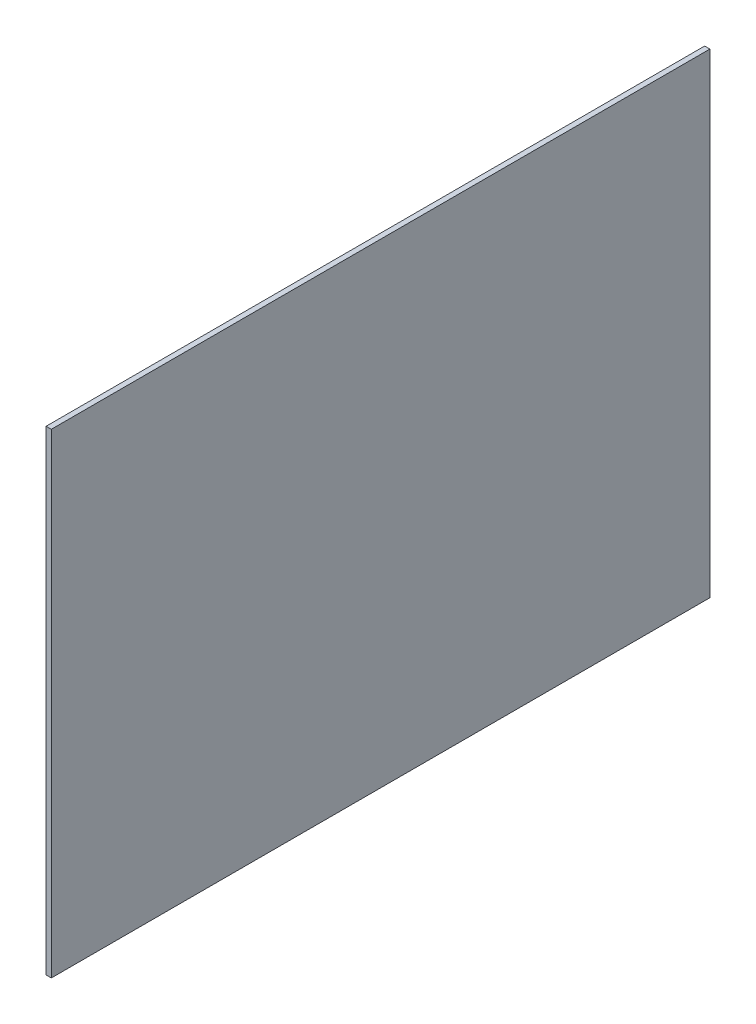
ISO-10303-21;
HEADER;
FILE_DESCRIPTION(('STEP AP214'),'2;1');
FILE_NAME('part.step','',(''),(''),'','','');
FILE_SCHEMA(('AUTOMOTIVE_DESIGN { 1 0 10303 214 1 1 1 1 }'));
ENDSEC;
DATA;
#1=APPLICATION_CONTEXT('core data for automotive mechanical design processes');
#2=APPLICATION_PROTOCOL_DEFINITION('international standard','automotive_design',2000,#1);
#3=PRODUCT_CONTEXT('',#1,'mechanical');
#4=PRODUCT('Part','Part','',(#3));
#5=PRODUCT_RELATED_PRODUCT_CATEGORY('part','',(#4));
#6=PRODUCT_DEFINITION_FORMATION('','',#4);
#7=PRODUCT_DEFINITION_CONTEXT('part definition',#1,'design');
#8=PRODUCT_DEFINITION('design','',#6,#7);
#9=PRODUCT_DEFINITION_SHAPE('','',#8);
#10=(LENGTH_UNIT() NAMED_UNIT(*) SI_UNIT(.MILLI.,.METRE.));
#11=(NAMED_UNIT(*) PLANE_ANGLE_UNIT() SI_UNIT($,.RADIAN.));
#12=(NAMED_UNIT(*) SI_UNIT($,.STERADIAN.) SOLID_ANGLE_UNIT());
#13=UNCERTAINTY_MEASURE_WITH_UNIT(LENGTH_MEASURE(1.E-05),#10,'distance_accuracy_value','');
#14=(GEOMETRIC_REPRESENTATION_CONTEXT(3) GLOBAL_UNCERTAINTY_ASSIGNED_CONTEXT((#13)) GLOBAL_UNIT_ASSIGNED_CONTEXT((#10,
#11,#12)) REPRESENTATION_CONTEXT('',''));
#15=CARTESIAN_POINT('',(0.,0.,0.));
#16=DIRECTION('',(0.,0.,1.));
#17=DIRECTION('',(1.,0.,0.));
#18=AXIS2_PLACEMENT_3D('',#15,#16,#17);
#19=CARTESIAN_POINT('',(-754.231317194732,90.909375740857,128.020467364411));
#20=DIRECTION('',(0.,0.,-1.));
#21=DIRECTION('',(-1.,0.,0.));
#22=AXIS2_PLACEMENT_3D('',#19,#20,#21);
#23=PLANE('',#22);
#24=DIRECTION('',(0.,-1.,0.));
#25=VECTOR('',#24,1.);
#26=CARTESIAN_POINT('',(-755.231317194732,90.909375740857,128.020467364411));
#27=LINE('',#26,#25);
#28=CARTESIAN_POINT('',(-755.231317194732,90.909375740857,128.020467364411));
#29=VERTEX_POINT('',#28);
#30=CARTESIAN_POINT('',(-755.231317194732,-1.35308431126191E-13,128.020467364411));
#31=VERTEX_POINT('',#30);
#32=EDGE_CURVE('E101',#29,#31,#27,.T.);
#33=ORIENTED_EDGE('',*,*,#32,.T.);
#34=DIRECTION('',(-1.,0.,0.));
#35=VECTOR('',#34,1.);
#36=CARTESIAN_POINT('',(-754.231317194732,-1.35308431126191E-13,128.020467364411));
#37=LINE('',#36,#35);
#38=CARTESIAN_POINT('',(-754.231317194732,-1.35308431126191E-13,128.020467364411));
#39=VERTEX_POINT('',#38);
#40=EDGE_CURVE('E11',#39,#31,#37,.T.);
#41=ORIENTED_EDGE('',*,*,#40,.F.);
#42=DIRECTION('',(0.,-1.,0.));
#43=VECTOR('',#42,1.);
#44=CARTESIAN_POINT('',(-754.231317194732,90.909375740857,128.020467364411));
#45=LINE('',#44,#43);
#46=CARTESIAN_POINT('',(-754.231317194732,90.909375740857,128.020467364411));
#47=VERTEX_POINT('',#46);
#48=EDGE_CURVE('E89',#47,#39,#45,.T.);
#49=ORIENTED_EDGE('',*,*,#48,.F.);
#50=DIRECTION('',(-1.,0.,0.));
#51=VECTOR('',#50,1.);
#52=CARTESIAN_POINT('',(-754.231317194732,90.909375740857,128.020467364411));
#53=LINE('',#52,#51);
#54=EDGE_CURVE('E97',#47,#29,#53,.T.);
#55=ORIENTED_EDGE('',*,*,#54,.T.);
#56=EDGE_LOOP('',(#33,#41,#49,#55));
#57=FACE_BOUND('',#56,.T.);
#58=ADVANCED_FACE('F38',(#57),#23,.F.);
#59=CARTESIAN_POINT('',(-754.231317194732,-1.35308431126191E-13,128.020467364411));
#60=DIRECTION('',(0.,1.,0.));
#61=DIRECTION('',(0.,0.,1.));
#62=AXIS2_PLACEMENT_3D('',#59,#60,#61);
#63=PLANE('',#62);
#64=DIRECTION('',(0.,0.,-1.));
#65=VECTOR('',#64,1.);
#66=CARTESIAN_POINT('',(-755.231317194732,-1.35308431126191E-13,128.020467364411));
#67=LINE('',#66,#65);
#68=CARTESIAN_POINT('',(-755.231317194732,-1.35308431126191E-13,2.02046736441129));
#69=VERTEX_POINT('',#68);
#70=EDGE_CURVE('E93',#31,#69,#67,.T.);
#71=ORIENTED_EDGE('',*,*,#70,.T.);
#72=DIRECTION('',(-1.,0.,0.));
#73=VECTOR('',#72,1.);
#74=CARTESIAN_POINT('',(-754.231317194732,-1.35308431126191E-13,2.02046736441129));
#75=LINE('',#74,#73);
#76=CARTESIAN_POINT('',(-754.231317194732,-1.35308431126191E-13,2.02046736441129));
#77=VERTEX_POINT('',#76);
#78=EDGE_CURVE('E46',#77,#69,#75,.T.);
#79=ORIENTED_EDGE('',*,*,#78,.F.);
#80=DIRECTION('',(0.,0.,-1.));
#81=VECTOR('',#80,1.);
#82=CARTESIAN_POINT('',(-754.231317194732,-1.35308431126191E-13,128.020467364411));
#83=LINE('',#82,#81);
#84=EDGE_CURVE('E84',#39,#77,#83,.T.);
#85=ORIENTED_EDGE('',*,*,#84,.F.);
#86=ORIENTED_EDGE('',*,*,#40,.T.);
#87=EDGE_LOOP('',(#71,#79,#85,#86));
#88=FACE_BOUND('',#87,.T.);
#89=ADVANCED_FACE('F92',(#88),#63,.F.);
#90=CARTESIAN_POINT('',(-754.231317194732,90.909375740857,2.02046736441129));
#91=DIRECTION('',(0.,0.,1.));
#92=DIRECTION('',(1.,0.,0.));
#93=AXIS2_PLACEMENT_3D('',#90,#91,#92);
#94=PLANE('',#93);
#95=DIRECTION('',(0.,1.,0.));
#96=VECTOR('',#95,1.);
#97=CARTESIAN_POINT('',(-755.231317194732,90.909375740857,2.02046736441129));
#98=LINE('',#97,#96);
#99=CARTESIAN_POINT('',(-755.231317194732,90.909375740857,2.02046736441129));
#100=VERTEX_POINT('',#99);
#101=EDGE_CURVE('E71',#69,#100,#98,.T.);
#102=ORIENTED_EDGE('',*,*,#101,.T.);
#103=DIRECTION('',(-1.,0.,0.));
#104=VECTOR('',#103,1.);
#105=CARTESIAN_POINT('',(-754.231317194732,90.909375740857,2.02046736441129));
#106=LINE('',#105,#104);
#107=CARTESIAN_POINT('',(-754.231317194732,90.909375740857,2.02046736441129));
#108=VERTEX_POINT('',#107);
#109=EDGE_CURVE('E94',#108,#100,#106,.T.);
#110=ORIENTED_EDGE('',*,*,#109,.F.);
#111=DIRECTION('',(0.,1.,0.));
#112=VECTOR('',#111,1.);
#113=CARTESIAN_POINT('',(-754.231317194732,90.909375740857,2.02046736441129));
#114=LINE('',#113,#112);
#115=EDGE_CURVE('E87',#77,#108,#114,.T.);
#116=ORIENTED_EDGE('',*,*,#115,.F.);
#117=ORIENTED_EDGE('',*,*,#78,.T.);
#118=EDGE_LOOP('',(#102,#110,#116,#117));
#119=FACE_BOUND('',#118,.T.);
#120=ADVANCED_FACE('F95',(#119),#94,.F.);
#121=CARTESIAN_POINT('',(-754.231317194732,90.909375740857,128.020467364411));
#122=DIRECTION('',(0.,-1.,0.));
#123=DIRECTION('',(0.,0.,-1.));
#124=AXIS2_PLACEMENT_3D('',#121,#122,#123);
#125=PLANE('',#124);
#126=DIRECTION('',(0.,0.,1.));
#127=VECTOR('',#126,1.);
#128=CARTESIAN_POINT('',(-755.231317194732,90.909375740857,128.020467364411));
#129=LINE('',#128,#127);
#130=EDGE_CURVE('E77',#100,#29,#129,.T.);
#131=ORIENTED_EDGE('',*,*,#130,.T.);
#132=ORIENTED_EDGE('',*,*,#54,.F.);
#133=DIRECTION('',(0.,0.,1.));
#134=VECTOR('',#133,1.);
#135=CARTESIAN_POINT('',(-754.231317194732,90.909375740857,128.020467364411));
#136=LINE('',#135,#134);
#137=EDGE_CURVE('E54',#108,#47,#136,.T.);
#138=ORIENTED_EDGE('',*,*,#137,.F.);
#139=ORIENTED_EDGE('',*,*,#109,.T.);
#140=EDGE_LOOP('',(#131,#132,#138,#139));
#141=FACE_BOUND('',#140,.T.);
#142=ADVANCED_FACE('F108',(#141),#125,.F.);
#143=CARTESIAN_POINT('',(-754.231317194732,0.,0.));
#144=DIRECTION('',(1.,0.,0.));
#145=DIRECTION('',(0.,0.,-1.));
#146=AXIS2_PLACEMENT_3D('',#143,#144,#145);
#147=PLANE('',#146);
#148=ORIENTED_EDGE('',*,*,#48,.T.);
#149=ORIENTED_EDGE('',*,*,#84,.T.);
#150=ORIENTED_EDGE('',*,*,#115,.T.);
#151=ORIENTED_EDGE('',*,*,#137,.T.);
#152=EDGE_LOOP('',(#148,#149,#150,#151));
#153=FACE_BOUND('',#152,.T.);
#154=ADVANCED_FACE('F85',(#153),#147,.T.);
#155=CARTESIAN_POINT('',(-755.231317194732,0.,0.));
#156=DIRECTION('',(1.,0.,0.));
#157=DIRECTION('',(0.,0.,-1.));
#158=AXIS2_PLACEMENT_3D('',#155,#156,#157);
#159=PLANE('',#158);
#160=ORIENTED_EDGE('',*,*,#32,.F.);
#161=ORIENTED_EDGE('',*,*,#130,.F.);
#162=ORIENTED_EDGE('',*,*,#101,.F.);
#163=ORIENTED_EDGE('',*,*,#70,.F.);
#164=EDGE_LOOP('',(#160,#161,#162,#163));
#165=FACE_BOUND('',#164,.T.);
#166=ADVANCED_FACE('F111',(#165),#159,.F.);
#167=CLOSED_SHELL('',(#58,#89,#120,#142,#154,#166));
#168=MANIFOLD_SOLID_BREP('B2',#167);
#169=ADVANCED_BREP_SHAPE_REPRESENTATION('',(#18,#168),#14);
#170=SHAPE_DEFINITION_REPRESENTATION(#9,#169);
ENDSEC;
END-ISO-10303-21;
